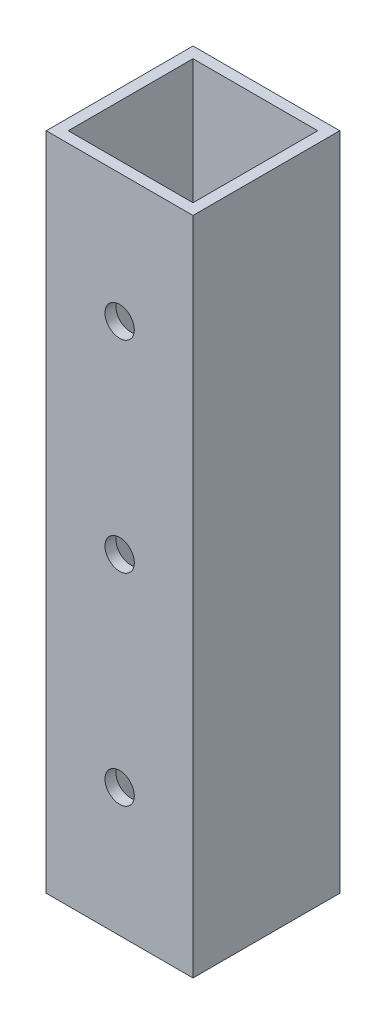
ISO-10303-21;
HEADER;
FILE_DESCRIPTION(('STEP AP214'),'2;1');
FILE_NAME('part.step','',(''),(''),'','','');
FILE_SCHEMA(('AUTOMOTIVE_DESIGN { 1 0 10303 214 1 1 1 1 }'));
ENDSEC;
DATA;
#1=APPLICATION_CONTEXT('core data for automotive mechanical design processes');
#2=APPLICATION_PROTOCOL_DEFINITION('international standard','automotive_design',2000,#1);
#3=PRODUCT_CONTEXT('',#1,'mechanical');
#4=PRODUCT('Part','Part','',(#3));
#5=PRODUCT_RELATED_PRODUCT_CATEGORY('part','',(#4));
#6=PRODUCT_DEFINITION_FORMATION('','',#4);
#7=PRODUCT_DEFINITION_CONTEXT('part definition',#1,'design');
#8=PRODUCT_DEFINITION('design','',#6,#7);
#9=PRODUCT_DEFINITION_SHAPE('','',#8);
#10=(LENGTH_UNIT() NAMED_UNIT(*) SI_UNIT(.MILLI.,.METRE.));
#11=(NAMED_UNIT(*) PLANE_ANGLE_UNIT() SI_UNIT($,.RADIAN.));
#12=(NAMED_UNIT(*) SI_UNIT($,.STERADIAN.) SOLID_ANGLE_UNIT());
#13=UNCERTAINTY_MEASURE_WITH_UNIT(LENGTH_MEASURE(1.E-05),#10,'distance_accuracy_value','');
#14=(GEOMETRIC_REPRESENTATION_CONTEXT(3) GLOBAL_UNCERTAINTY_ASSIGNED_CONTEXT((#13)) GLOBAL_UNIT_ASSIGNED_CONTEXT((#10,
#11,#12)) REPRESENTATION_CONTEXT('',''));
#15=CARTESIAN_POINT('',(0.,0.,0.));
#16=DIRECTION('',(0.,0.,1.));
#17=DIRECTION('',(1.,0.,0.));
#18=AXIS2_PLACEMENT_3D('',#15,#16,#17);
#19=CARTESIAN_POINT('',(0.,90.,0.));
#20=DIRECTION('',(0.,1.,0.));
#21=DIRECTION('',(0.,0.,1.));
#22=AXIS2_PLACEMENT_3D('',#19,#20,#21);
#23=PLANE('',#22);
#24=DIRECTION('',(0.,0.,-1.));
#25=VECTOR('',#24,1.);
#26=CARTESIAN_POINT('',(10.,90.,-10.));
#27=LINE('',#26,#25);
#28=CARTESIAN_POINT('',(10.,90.,10.));
#29=VERTEX_POINT('',#28);
#30=CARTESIAN_POINT('',(10.,90.,-10.));
#31=VERTEX_POINT('',#30);
#32=EDGE_CURVE('E144',#29,#31,#27,.T.);
#33=ORIENTED_EDGE('',*,*,#32,.T.);
#34=DIRECTION('',(-1.,0.,0.));
#35=VECTOR('',#34,1.);
#36=CARTESIAN_POINT('',(-10.,90.,-10.));
#37=LINE('',#36,#35);
#38=CARTESIAN_POINT('',(-10.,90.,-10.));
#39=VERTEX_POINT('',#38);
#40=EDGE_CURVE('E147',#31,#39,#37,.T.);
#41=ORIENTED_EDGE('',*,*,#40,.T.);
#42=DIRECTION('',(0.,0.,1.));
#43=VECTOR('',#42,1.);
#44=CARTESIAN_POINT('',(-10.,90.,-10.));
#45=LINE('',#44,#43);
#46=CARTESIAN_POINT('',(-10.,90.,10.));
#47=VERTEX_POINT('',#46);
#48=EDGE_CURVE('E150',#39,#47,#45,.T.);
#49=ORIENTED_EDGE('',*,*,#48,.T.);
#50=DIRECTION('',(1.,0.,0.));
#51=VECTOR('',#50,1.);
#52=CARTESIAN_POINT('',(-10.,90.,10.));
#53=LINE('',#52,#51);
#54=EDGE_CURVE('E152',#47,#29,#53,.T.);
#55=ORIENTED_EDGE('',*,*,#54,.T.);
#56=EDGE_LOOP('',(#33,#41,#49,#55));
#57=FACE_BOUND('',#56,.T.);
#58=DIRECTION('',(-1.,0.,0.));
#59=VECTOR('',#58,1.);
#60=CARTESIAN_POINT('',(-8.5,90.,-8.5));
#61=LINE('',#60,#59);
#62=CARTESIAN_POINT('',(8.5,90.,-8.5));
#63=VERTEX_POINT('',#62);
#64=CARTESIAN_POINT('',(-8.5,90.,-8.5));
#65=VERTEX_POINT('',#64);
#66=EDGE_CURVE('E114',#63,#65,#61,.T.);
#67=ORIENTED_EDGE('',*,*,#66,.F.);
#68=DIRECTION('',(0.,0.,-1.));
#69=VECTOR('',#68,1.);
#70=CARTESIAN_POINT('',(8.5,90.,-8.5));
#71=LINE('',#70,#69);
#72=CARTESIAN_POINT('',(8.5,90.,8.5));
#73=VERTEX_POINT('',#72);
#74=EDGE_CURVE('E106',#73,#63,#71,.T.);
#75=ORIENTED_EDGE('',*,*,#74,.F.);
#76=DIRECTION('',(1.,0.,0.));
#77=VECTOR('',#76,1.);
#78=CARTESIAN_POINT('',(-8.5,90.,8.5));
#79=LINE('',#78,#77);
#80=CARTESIAN_POINT('',(-8.5,90.,8.5));
#81=VERTEX_POINT('',#80);
#82=EDGE_CURVE('E128',#81,#73,#79,.T.);
#83=ORIENTED_EDGE('',*,*,#82,.F.);
#84=DIRECTION('',(0.,0.,1.));
#85=VECTOR('',#84,1.);
#86=CARTESIAN_POINT('',(-8.5,90.,-8.5));
#87=LINE('',#86,#85);
#88=EDGE_CURVE('E126',#65,#81,#87,.T.);
#89=ORIENTED_EDGE('',*,*,#88,.F.);
#90=EDGE_LOOP('',(#67,#75,#83,#89));
#91=FACE_BOUND('',#90,.T.);
#92=ADVANCED_FACE('F39',(#57,#91),#23,.T.);
#93=CARTESIAN_POINT('',(0.,0.,0.));
#94=DIRECTION('',(0.,1.,0.));
#95=DIRECTION('',(0.,0.,1.));
#96=AXIS2_PLACEMENT_3D('',#93,#94,#95);
#97=PLANE('',#96);
#98=DIRECTION('',(0.,0.,-1.));
#99=VECTOR('',#98,1.);
#100=CARTESIAN_POINT('',(10.,0.,-10.));
#101=LINE('',#100,#99);
#102=CARTESIAN_POINT('',(10.,0.,10.));
#103=VERTEX_POINT('',#102);
#104=CARTESIAN_POINT('',(10.,0.,-10.));
#105=VERTEX_POINT('',#104);
#106=EDGE_CURVE('E122',#103,#105,#101,.T.);
#107=ORIENTED_EDGE('',*,*,#106,.F.);
#108=DIRECTION('',(1.,0.,0.));
#109=VECTOR('',#108,1.);
#110=CARTESIAN_POINT('',(-10.,0.,10.));
#111=LINE('',#110,#109);
#112=CARTESIAN_POINT('',(-10.,0.,10.));
#113=VERTEX_POINT('',#112);
#114=EDGE_CURVE('E148',#113,#103,#111,.T.);
#115=ORIENTED_EDGE('',*,*,#114,.F.);
#116=DIRECTION('',(0.,0.,1.));
#117=VECTOR('',#116,1.);
#118=CARTESIAN_POINT('',(-10.,0.,-10.));
#119=LINE('',#118,#117);
#120=CARTESIAN_POINT('',(-10.,0.,-10.));
#121=VERTEX_POINT('',#120);
#122=EDGE_CURVE('E159',#121,#113,#119,.T.);
#123=ORIENTED_EDGE('',*,*,#122,.F.);
#124=DIRECTION('',(-1.,0.,0.));
#125=VECTOR('',#124,1.);
#126=CARTESIAN_POINT('',(-10.,0.,-10.));
#127=LINE('',#126,#125);
#128=EDGE_CURVE('E157',#105,#121,#127,.T.);
#129=ORIENTED_EDGE('',*,*,#128,.F.);
#130=EDGE_LOOP('',(#107,#115,#123,#129));
#131=FACE_BOUND('',#130,.T.);
#132=DIRECTION('',(0.,0.,-1.));
#133=VECTOR('',#132,1.);
#134=CARTESIAN_POINT('',(8.5,0.,-8.5));
#135=LINE('',#134,#133);
#136=CARTESIAN_POINT('',(8.5,0.,8.5));
#137=VERTEX_POINT('',#136);
#138=CARTESIAN_POINT('',(8.5,0.,-8.5));
#139=VERTEX_POINT('',#138);
#140=EDGE_CURVE('E64',#137,#139,#135,.T.);
#141=ORIENTED_EDGE('',*,*,#140,.T.);
#142=DIRECTION('',(-1.,0.,0.));
#143=VECTOR('',#142,1.);
#144=CARTESIAN_POINT('',(-8.5,0.,-8.5));
#145=LINE('',#144,#143);
#146=CARTESIAN_POINT('',(-8.5,0.,-8.5));
#147=VERTEX_POINT('',#146);
#148=EDGE_CURVE('E121',#139,#147,#145,.T.);
#149=ORIENTED_EDGE('',*,*,#148,.T.);
#150=DIRECTION('',(0.,0.,1.));
#151=VECTOR('',#150,1.);
#152=CARTESIAN_POINT('',(-8.5,0.,-8.5));
#153=LINE('',#152,#151);
#154=CARTESIAN_POINT('',(-8.5,0.,8.5));
#155=VERTEX_POINT('',#154);
#156=EDGE_CURVE('E136',#147,#155,#153,.T.);
#157=ORIENTED_EDGE('',*,*,#156,.T.);
#158=DIRECTION('',(1.,0.,0.));
#159=VECTOR('',#158,1.);
#160=CARTESIAN_POINT('',(-8.5,0.,8.5));
#161=LINE('',#160,#159);
#162=EDGE_CURVE('E115',#155,#137,#161,.T.);
#163=ORIENTED_EDGE('',*,*,#162,.T.);
#164=EDGE_LOOP('',(#141,#149,#157,#163));
#165=FACE_BOUND('',#164,.T.);
#166=ADVANCED_FACE('F220',(#131,#165),#97,.F.);
#167=CARTESIAN_POINT('',(10.,90.,-10.));
#168=DIRECTION('',(-1.,0.,0.));
#169=DIRECTION('',(0.,0.,1.));
#170=AXIS2_PLACEMENT_3D('',#167,#168,#169);
#171=PLANE('',#170);
#172=ORIENTED_EDGE('',*,*,#106,.T.);
#173=DIRECTION('',(0.,-1.,0.));
#174=VECTOR('',#173,1.);
#175=CARTESIAN_POINT('',(10.,90.,-10.));
#176=LINE('',#175,#174);
#177=EDGE_CURVE('E11',#31,#105,#176,.T.);
#178=ORIENTED_EDGE('',*,*,#177,.F.);
#179=ORIENTED_EDGE('',*,*,#32,.F.);
#180=DIRECTION('',(0.,-1.,0.));
#181=VECTOR('',#180,1.);
#182=CARTESIAN_POINT('',(10.,90.,10.));
#183=LINE('',#182,#181);
#184=EDGE_CURVE('E154',#29,#103,#183,.T.);
#185=ORIENTED_EDGE('',*,*,#184,.T.);
#186=EDGE_LOOP('',(#172,#178,#179,#185));
#187=FACE_BOUND('',#186,.T.);
#188=ADVANCED_FACE('F41',(#187),#171,.F.);
#189=CARTESIAN_POINT('',(-10.,90.,-10.));
#190=DIRECTION('',(0.,0.,1.));
#191=DIRECTION('',(1.,0.,0.));
#192=AXIS2_PLACEMENT_3D('',#189,#190,#191);
#193=PLANE('',#192);
#194=CARTESIAN_POINT('',(0.,72.5,-10.));
#195=DIRECTION('',(0.,0.,-1.));
#196=DIRECTION('',(-1.,0.,0.));
#197=AXIS2_PLACEMENT_3D('',#194,#195,#196);
#198=CIRCLE('',#197,2.);
#199=CARTESIAN_POINT('',(-2.,72.5,-10.));
#200=VERTEX_POINT('',#199);
#201=EDGE_CURVE('E172',#200,#200,#198,.T.);
#202=ORIENTED_EDGE('',*,*,#201,.F.);
#203=EDGE_LOOP('',(#202));
#204=FACE_BOUND('',#203,.T.);
#205=CARTESIAN_POINT('',(0.,17.5,-10.));
#206=DIRECTION('',(0.,0.,-1.));
#207=DIRECTION('',(1.,0.,0.));
#208=AXIS2_PLACEMENT_3D('',#205,#206,#207);
#209=CIRCLE('',#208,2.);
#210=CARTESIAN_POINT('',(2.,17.5,-10.));
#211=VERTEX_POINT('',#210);
#212=EDGE_CURVE('E249',#211,#211,#209,.T.);
#213=ORIENTED_EDGE('',*,*,#212,.F.);
#214=EDGE_LOOP('',(#213));
#215=FACE_BOUND('',#214,.T.);
#216=CARTESIAN_POINT('',(0.,45.,-10.));
#217=DIRECTION('',(0.,0.,-1.));
#218=DIRECTION('',(-1.,0.,0.));
#219=AXIS2_PLACEMENT_3D('',#216,#217,#218);
#220=CIRCLE('',#219,2.);
#221=CARTESIAN_POINT('',(-2.,45.,-10.));
#222=VERTEX_POINT('',#221);
#223=EDGE_CURVE('E253',#222,#222,#220,.T.);
#224=ORIENTED_EDGE('',*,*,#223,.F.);
#225=EDGE_LOOP('',(#224));
#226=FACE_BOUND('',#225,.T.);
#227=ORIENTED_EDGE('',*,*,#128,.T.);
#228=DIRECTION('',(0.,-1.,0.));
#229=VECTOR('',#228,1.);
#230=CARTESIAN_POINT('',(-10.,90.,-10.));
#231=LINE('',#230,#229);
#232=EDGE_CURVE('E48',#39,#121,#231,.T.);
#233=ORIENTED_EDGE('',*,*,#232,.F.);
#234=ORIENTED_EDGE('',*,*,#40,.F.);
#235=ORIENTED_EDGE('',*,*,#177,.T.);
#236=EDGE_LOOP('',(#227,#233,#234,#235));
#237=FACE_BOUND('',#236,.T.);
#238=ADVANCED_FACE('F235',(#204,#215,#226,#237),#193,.F.);
#239=CARTESIAN_POINT('',(-10.,90.,-10.));
#240=DIRECTION('',(1.,0.,0.));
#241=DIRECTION('',(0.,0.,-1.));
#242=AXIS2_PLACEMENT_3D('',#239,#240,#241);
#243=PLANE('',#242);
#244=ORIENTED_EDGE('',*,*,#122,.T.);
#245=DIRECTION('',(0.,-1.,0.));
#246=VECTOR('',#245,1.);
#247=CARTESIAN_POINT('',(-10.,90.,10.));
#248=LINE('',#247,#246);
#249=EDGE_CURVE('E164',#47,#113,#248,.T.);
#250=ORIENTED_EDGE('',*,*,#249,.F.);
#251=ORIENTED_EDGE('',*,*,#48,.F.);
#252=ORIENTED_EDGE('',*,*,#232,.T.);
#253=EDGE_LOOP('',(#244,#250,#251,#252));
#254=FACE_BOUND('',#253,.T.);
#255=ADVANCED_FACE('F233',(#254),#243,.F.);
#256=CARTESIAN_POINT('',(-10.,90.,10.));
#257=DIRECTION('',(0.,0.,-1.));
#258=DIRECTION('',(-1.,0.,0.));
#259=AXIS2_PLACEMENT_3D('',#256,#257,#258);
#260=PLANE('',#259);
#261=CARTESIAN_POINT('',(0.,72.5,9.99999999999999));
#262=DIRECTION('',(0.,0.,-1.));
#263=DIRECTION('',(-1.,0.,0.));
#264=AXIS2_PLACEMENT_3D('',#261,#262,#263);
#265=CIRCLE('',#264,2.);
#266=CARTESIAN_POINT('',(-2.,72.5,10.));
#267=VERTEX_POINT('',#266);
#268=EDGE_CURVE('E134',#267,#267,#265,.T.);
#269=ORIENTED_EDGE('',*,*,#268,.T.);
#270=EDGE_LOOP('',(#269));
#271=FACE_BOUND('',#270,.T.);
#272=CARTESIAN_POINT('',(0.,17.5,9.99999999999999));
#273=DIRECTION('',(0.,0.,-1.));
#274=DIRECTION('',(-1.,0.,0.));
#275=AXIS2_PLACEMENT_3D('',#272,#273,#274);
#276=CIRCLE('',#275,2.);
#277=CARTESIAN_POINT('',(-2.,17.5,10.));
#278=VERTEX_POINT('',#277);
#279=EDGE_CURVE('E180',#278,#278,#276,.T.);
#280=ORIENTED_EDGE('',*,*,#279,.T.);
#281=EDGE_LOOP('',(#280));
#282=FACE_BOUND('',#281,.T.);
#283=CARTESIAN_POINT('',(0.,45.,9.99999999999999));
#284=DIRECTION('',(0.,0.,-1.));
#285=DIRECTION('',(-1.,0.,0.));
#286=AXIS2_PLACEMENT_3D('',#283,#284,#285);
#287=CIRCLE('',#286,2.);
#288=CARTESIAN_POINT('',(-2.,45.,10.));
#289=VERTEX_POINT('',#288);
#290=EDGE_CURVE('E176',#289,#289,#287,.T.);
#291=ORIENTED_EDGE('',*,*,#290,.T.);
#292=EDGE_LOOP('',(#291));
#293=FACE_BOUND('',#292,.T.);
#294=ORIENTED_EDGE('',*,*,#114,.T.);
#295=ORIENTED_EDGE('',*,*,#184,.F.);
#296=ORIENTED_EDGE('',*,*,#54,.F.);
#297=ORIENTED_EDGE('',*,*,#249,.T.);
#298=EDGE_LOOP('',(#294,#295,#296,#297));
#299=FACE_BOUND('',#298,.T.);
#300=ADVANCED_FACE('F197',(#271,#282,#293,#299),#260,.F.);
#301=CARTESIAN_POINT('',(8.5,90.,-8.5));
#302=DIRECTION('',(-1.,0.,0.));
#303=DIRECTION('',(0.,0.,1.));
#304=AXIS2_PLACEMENT_3D('',#301,#302,#303);
#305=PLANE('',#304);
#306=ORIENTED_EDGE('',*,*,#140,.F.);
#307=DIRECTION('',(0.,-1.,0.));
#308=VECTOR('',#307,1.);
#309=CARTESIAN_POINT('',(8.5,90.,8.5));
#310=LINE('',#309,#308);
#311=EDGE_CURVE('E110',#73,#137,#310,.T.);
#312=ORIENTED_EDGE('',*,*,#311,.F.);
#313=ORIENTED_EDGE('',*,*,#74,.T.);
#314=DIRECTION('',(0.,-1.,0.));
#315=VECTOR('',#314,1.);
#316=CARTESIAN_POINT('',(8.5,90.,-8.5));
#317=LINE('',#316,#315);
#318=EDGE_CURVE('E109',#63,#139,#317,.T.);
#319=ORIENTED_EDGE('',*,*,#318,.T.);
#320=EDGE_LOOP('',(#306,#312,#313,#319));
#321=FACE_BOUND('',#320,.T.);
#322=ADVANCED_FACE('F108',(#321),#305,.T.);
#323=CARTESIAN_POINT('',(-8.5,90.,-8.5));
#324=DIRECTION('',(0.,0.,1.));
#325=DIRECTION('',(1.,0.,0.));
#326=AXIS2_PLACEMENT_3D('',#323,#324,#325);
#327=PLANE('',#326);
#328=CARTESIAN_POINT('',(0.,72.5,-8.50000000000001));
#329=DIRECTION('',(0.,0.,1.));
#330=DIRECTION('',(1.,0.,0.));
#331=AXIS2_PLACEMENT_3D('',#328,#329,#330);
#332=CIRCLE('',#331,2.);
#333=CARTESIAN_POINT('',(2.,72.5,-8.50000000000001));
#334=VERTEX_POINT('',#333);
#335=EDGE_CURVE('E192',#334,#334,#332,.T.);
#336=ORIENTED_EDGE('',*,*,#335,.F.);
#337=EDGE_LOOP('',(#336));
#338=FACE_BOUND('',#337,.T.);
#339=CARTESIAN_POINT('',(0.,17.5,-8.50000000000001));
#340=DIRECTION('',(0.,0.,1.));
#341=DIRECTION('',(1.,0.,0.));
#342=AXIS2_PLACEMENT_3D('',#339,#340,#341);
#343=CIRCLE('',#342,2.);
#344=CARTESIAN_POINT('',(2.,17.5,-8.50000000000001));
#345=VERTEX_POINT('',#344);
#346=EDGE_CURVE('E175',#345,#345,#343,.T.);
#347=ORIENTED_EDGE('',*,*,#346,.F.);
#348=EDGE_LOOP('',(#347));
#349=FACE_BOUND('',#348,.T.);
#350=CARTESIAN_POINT('',(0.,45.,-8.50000000000001));
#351=DIRECTION('',(0.,0.,1.));
#352=DIRECTION('',(1.,0.,0.));
#353=AXIS2_PLACEMENT_3D('',#350,#351,#352);
#354=CIRCLE('',#353,2.);
#355=CARTESIAN_POINT('',(2.,45.,-8.50000000000001));
#356=VERTEX_POINT('',#355);
#357=EDGE_CURVE('E171',#356,#356,#354,.T.);
#358=ORIENTED_EDGE('',*,*,#357,.F.);
#359=EDGE_LOOP('',(#358));
#360=FACE_BOUND('',#359,.T.);
#361=ORIENTED_EDGE('',*,*,#148,.F.);
#362=ORIENTED_EDGE('',*,*,#318,.F.);
#363=ORIENTED_EDGE('',*,*,#66,.T.);
#364=DIRECTION('',(0.,-1.,0.));
#365=VECTOR('',#364,1.);
#366=CARTESIAN_POINT('',(-8.5,90.,-8.5));
#367=LINE('',#366,#365);
#368=EDGE_CURVE('E123',#65,#147,#367,.T.);
#369=ORIENTED_EDGE('',*,*,#368,.T.);
#370=EDGE_LOOP('',(#361,#362,#363,#369));
#371=FACE_BOUND('',#370,.T.);
#372=ADVANCED_FACE('F118',(#338,#349,#360,#371),#327,.T.);
#373=CARTESIAN_POINT('',(-8.5,90.,-8.5));
#374=DIRECTION('',(1.,0.,0.));
#375=DIRECTION('',(0.,0.,-1.));
#376=AXIS2_PLACEMENT_3D('',#373,#374,#375);
#377=PLANE('',#376);
#378=ORIENTED_EDGE('',*,*,#156,.F.);
#379=ORIENTED_EDGE('',*,*,#368,.F.);
#380=ORIENTED_EDGE('',*,*,#88,.T.);
#381=DIRECTION('',(0.,-1.,0.));
#382=VECTOR('',#381,1.);
#383=CARTESIAN_POINT('',(-8.5,90.,8.5));
#384=LINE('',#383,#382);
#385=EDGE_CURVE('E56',#81,#155,#384,.T.);
#386=ORIENTED_EDGE('',*,*,#385,.T.);
#387=EDGE_LOOP('',(#378,#379,#380,#386));
#388=FACE_BOUND('',#387,.T.);
#389=ADVANCED_FACE('F269',(#388),#377,.T.);
#390=CARTESIAN_POINT('',(-8.5,90.,8.5));
#391=DIRECTION('',(0.,0.,-1.));
#392=DIRECTION('',(-1.,0.,0.));
#393=AXIS2_PLACEMENT_3D('',#390,#391,#392);
#394=PLANE('',#393);
#395=CARTESIAN_POINT('',(0.,72.5,8.50000000000001));
#396=DIRECTION('',(0.,0.,-1.));
#397=DIRECTION('',(-1.,0.,0.));
#398=AXIS2_PLACEMENT_3D('',#395,#396,#397);
#399=CIRCLE('',#398,2.);
#400=CARTESIAN_POINT('',(-2.,72.5,8.50000000000001));
#401=VERTEX_POINT('',#400);
#402=EDGE_CURVE('E43',#401,#401,#399,.T.);
#403=ORIENTED_EDGE('',*,*,#402,.F.);
#404=EDGE_LOOP('',(#403));
#405=FACE_BOUND('',#404,.T.);
#406=CARTESIAN_POINT('',(0.,17.5,8.50000000000001));
#407=DIRECTION('',(0.,0.,-1.));
#408=DIRECTION('',(-1.,0.,0.));
#409=AXIS2_PLACEMENT_3D('',#406,#407,#408);
#410=CIRCLE('',#409,2.);
#411=CARTESIAN_POINT('',(-2.,17.5,8.50000000000001));
#412=VERTEX_POINT('',#411);
#413=EDGE_CURVE('E173',#412,#412,#410,.T.);
#414=ORIENTED_EDGE('',*,*,#413,.F.);
#415=EDGE_LOOP('',(#414));
#416=FACE_BOUND('',#415,.T.);
#417=CARTESIAN_POINT('',(0.,45.,8.50000000000001));
#418=DIRECTION('',(0.,0.,-1.));
#419=DIRECTION('',(-1.,0.,0.));
#420=AXIS2_PLACEMENT_3D('',#417,#418,#419);
#421=CIRCLE('',#420,2.);
#422=CARTESIAN_POINT('',(-2.,45.,8.50000000000001));
#423=VERTEX_POINT('',#422);
#424=EDGE_CURVE('E169',#423,#423,#421,.T.);
#425=ORIENTED_EDGE('',*,*,#424,.F.);
#426=EDGE_LOOP('',(#425));
#427=FACE_BOUND('',#426,.T.);
#428=ORIENTED_EDGE('',*,*,#162,.F.);
#429=ORIENTED_EDGE('',*,*,#385,.F.);
#430=ORIENTED_EDGE('',*,*,#82,.T.);
#431=ORIENTED_EDGE('',*,*,#311,.T.);
#432=EDGE_LOOP('',(#428,#429,#430,#431));
#433=FACE_BOUND('',#432,.T.);
#434=ADVANCED_FACE('F267',(#405,#416,#427,#433),#394,.T.);
#435=CARTESIAN_POINT('',(0.,45.,90.));
#436=DIRECTION('',(0.,0.,-1.));
#437=DIRECTION('',(-1.,0.,0.));
#438=AXIS2_PLACEMENT_3D('',#435,#436,#437);
#439=CYLINDRICAL_SURFACE('',#438,2.);
#440=CARTESIAN_POINT('',(-2.,45.,8.50000000000001));
#441=CARTESIAN_POINT('',(-2.,45.,8.51562500000001));
#442=CARTESIAN_POINT('',(-2.,45.,8.53125000000001));
#443=CARTESIAN_POINT('',(-2.,45.,8.56250000000001));
#444=CARTESIAN_POINT('',(-2.,45.,8.57812500000001));
#445=CARTESIAN_POINT('',(-2.,45.,8.60937500000001));
#446=CARTESIAN_POINT('',(-2.,45.,8.62500000000001));
#447=CARTESIAN_POINT('',(-2.,45.,8.65625000000001));
#448=CARTESIAN_POINT('',(-2.,45.,8.67187500000001));
#449=CARTESIAN_POINT('',(-2.,45.,8.70312500000001));
#450=CARTESIAN_POINT('',(-2.,45.,8.71875000000001));
#451=CARTESIAN_POINT('',(-2.,45.,8.75));
#452=CARTESIAN_POINT('',(-2.,45.,8.765625));
#453=CARTESIAN_POINT('',(-2.,45.,8.796875));
#454=CARTESIAN_POINT('',(-2.,45.,8.81250000000001));
#455=CARTESIAN_POINT('',(-2.,45.,8.84375000000001));
#456=CARTESIAN_POINT('',(-2.,45.,8.85937500000001));
#457=CARTESIAN_POINT('',(-2.,45.,8.89062500000001));
#458=CARTESIAN_POINT('',(-2.,45.,8.90625000000001));
#459=CARTESIAN_POINT('',(-2.,45.,8.93750000000001));
#460=CARTESIAN_POINT('',(-2.,45.,8.95312500000001));
#461=CARTESIAN_POINT('',(-2.,45.,8.98437500000001));
#462=CARTESIAN_POINT('',(-2.,45.,9.00000000000001));
#463=CARTESIAN_POINT('',(-2.,45.,9.03125000000001));
#464=CARTESIAN_POINT('',(-2.,45.,9.04687500000001));
#465=CARTESIAN_POINT('',(-2.,45.,9.078125));
#466=CARTESIAN_POINT('',(-2.,45.,9.09375));
#467=CARTESIAN_POINT('',(-2.,45.,9.125));
#468=CARTESIAN_POINT('',(-2.,45.,9.14062500000001));
#469=CARTESIAN_POINT('',(-2.,45.,9.17187500000001));
#470=CARTESIAN_POINT('',(-2.,45.,9.18750000000001));
#471=CARTESIAN_POINT('',(-2.,45.,9.21875000000001));
#472=CARTESIAN_POINT('',(-2.,45.,9.23437500000001));
#473=CARTESIAN_POINT('',(-2.,45.,9.26562500000001));
#474=CARTESIAN_POINT('',(-2.,45.,9.28125000000001));
#475=CARTESIAN_POINT('',(-2.,45.,9.31250000000001));
#476=CARTESIAN_POINT('',(-2.,45.,9.32812500000001));
#477=CARTESIAN_POINT('',(-2.,45.,9.35937500000001));
#478=CARTESIAN_POINT('',(-2.,45.,9.37500000000001));
#479=CARTESIAN_POINT('',(-2.,45.,9.40625000000001));
#480=CARTESIAN_POINT('',(-2.,45.,9.42187500000002));
#481=CARTESIAN_POINT('',(-2.,45.,9.45312500000001));
#482=CARTESIAN_POINT('',(-2.,45.,9.46875000000001));
#483=CARTESIAN_POINT('',(-2.,45.,9.5));
#484=CARTESIAN_POINT('',(-2.,45.,9.51562500000001));
#485=CARTESIAN_POINT('',(-2.,45.,9.54687500000001));
#486=CARTESIAN_POINT('',(-2.,45.,9.56250000000001));
#487=CARTESIAN_POINT('',(-2.,45.,9.59375000000001));
#488=CARTESIAN_POINT('',(-2.,45.,9.60937500000001));
#489=CARTESIAN_POINT('',(-2.,45.,9.64062500000001));
#490=CARTESIAN_POINT('',(-2.,45.,9.65625000000001));
#491=CARTESIAN_POINT('',(-2.,45.,9.68750000000001));
#492=CARTESIAN_POINT('',(-2.,45.,9.70312500000001));
#493=CARTESIAN_POINT('',(-2.,45.,9.73437500000001));
#494=CARTESIAN_POINT('',(-2.,45.,9.75000000000001));
#495=CARTESIAN_POINT('',(-2.,45.,9.78125000000001));
#496=CARTESIAN_POINT('',(-2.,45.,9.79687500000001));
#497=CARTESIAN_POINT('',(-2.,45.,9.828125));
#498=CARTESIAN_POINT('',(-2.,45.,9.84375));
#499=CARTESIAN_POINT('',(-2.,45.,9.875));
#500=CARTESIAN_POINT('',(-2.,45.,9.89062500000001));
#501=CARTESIAN_POINT('',(-2.,45.,9.92187500000001));
#502=CARTESIAN_POINT('',(-2.,45.,9.93750000000001));
#503=CARTESIAN_POINT('',(-2.,45.,9.96875000000001));
#504=CARTESIAN_POINT('',(-2.,45.,9.98437500000001));
#505=CARTESIAN_POINT('',(-2.,45.,10.));
#506=B_SPLINE_CURVE_WITH_KNOTS('',3,(#440,#441,#442,#443,#444,#445,#446,#447,#448,#449,#450,
#451,#452,#453,#454,#455,#456,#457,#458,#459,#460,#461,#462,#463,#464,#465,#466,#467,#468,#469,
#470,#471,#472,#473,#474,#475,#476,#477,#478,#479,#480,#481,#482,#483,#484,#485,#486,#487,#488,
#489,#490,#491,#492,#493,#494,#495,#496,#497,#498,#499,#500,#501,#502,#503,#504,#505),
.UNSPECIFIED.,.F.,.F.,(4,2,2,2,2,2,2,2,2,2,2,2,2,2,2,2,2,2,2,2,2,2,2,2,2,2,2,2,2,2,2,2,4),(0.,
0.0468750000000018,0.0937500000000036,0.140625000000005,0.187500000000007,0.234374999999995,
0.281249999999997,0.328124999999999,0.375,0.421875000000002,0.468750000000004,0.515625000000006,
0.562499999999994,0.609374999999995,0.656249999999997,0.703124999999999,0.750000000000001,
0.796875000000002,0.843750000000004,0.890625000000006,0.937500000000008,0.984374999999996,
1.03125,1.078125,1.125,1.171875,1.21875,1.26562500000001,1.31249999999999,1.359375,1.40625,
1.453125,1.5),.UNSPECIFIED.);
#507=EDGE_CURVE('BSEAM214',#423,#289,#506,.T.);
#508=ORIENTED_EDGE('',*,*,#424,.T.);
#509=ORIENTED_EDGE('',*,*,#290,.F.);
#510=ORIENTED_EDGE('',*,*,#507,.T.);
#511=ORIENTED_EDGE('',*,*,#507,.F.);
#512=EDGE_LOOP('',(#508,#510,#509,#511));
#513=FACE_BOUND('',#512,.T.);
#514=ADVANCED_FACE('F214',(#513),#439,.F.);
#515=CARTESIAN_POINT('',(0.,17.5,90.));
#516=DIRECTION('',(0.,0.,-1.));
#517=DIRECTION('',(-1.,0.,0.));
#518=AXIS2_PLACEMENT_3D('',#515,#516,#517);
#519=CYLINDRICAL_SURFACE('',#518,2.);
#520=CARTESIAN_POINT('',(-2.,17.5,8.50000000000001));
#521=CARTESIAN_POINT('',(-2.,17.5,8.51562500000001));
#522=CARTESIAN_POINT('',(-2.,17.5,8.53125000000001));
#523=CARTESIAN_POINT('',(-2.,17.5,8.56250000000001));
#524=CARTESIAN_POINT('',(-2.,17.5,8.57812500000001));
#525=CARTESIAN_POINT('',(-2.,17.5,8.60937500000001));
#526=CARTESIAN_POINT('',(-2.,17.5,8.62500000000001));
#527=CARTESIAN_POINT('',(-2.,17.5,8.65625000000001));
#528=CARTESIAN_POINT('',(-2.,17.5,8.67187500000001));
#529=CARTESIAN_POINT('',(-2.,17.5,8.70312500000001));
#530=CARTESIAN_POINT('',(-2.,17.5,8.71875000000001));
#531=CARTESIAN_POINT('',(-2.,17.5,8.75));
#532=CARTESIAN_POINT('',(-2.,17.5,8.765625));
#533=CARTESIAN_POINT('',(-2.,17.5,8.796875));
#534=CARTESIAN_POINT('',(-2.,17.5,8.81250000000001));
#535=CARTESIAN_POINT('',(-2.,17.5,8.84375000000001));
#536=CARTESIAN_POINT('',(-2.,17.5,8.85937500000001));
#537=CARTESIAN_POINT('',(-2.,17.5,8.89062500000001));
#538=CARTESIAN_POINT('',(-2.,17.5,8.90625000000001));
#539=CARTESIAN_POINT('',(-2.,17.5,8.93750000000001));
#540=CARTESIAN_POINT('',(-2.,17.5,8.95312500000001));
#541=CARTESIAN_POINT('',(-2.,17.5,8.98437500000001));
#542=CARTESIAN_POINT('',(-2.,17.5,9.00000000000001));
#543=CARTESIAN_POINT('',(-2.,17.5,9.03125000000001));
#544=CARTESIAN_POINT('',(-2.,17.5,9.04687500000001));
#545=CARTESIAN_POINT('',(-2.,17.5,9.078125));
#546=CARTESIAN_POINT('',(-2.,17.5,9.09375));
#547=CARTESIAN_POINT('',(-2.,17.5,9.125));
#548=CARTESIAN_POINT('',(-2.,17.5,9.14062500000001));
#549=CARTESIAN_POINT('',(-2.,17.5,9.17187500000001));
#550=CARTESIAN_POINT('',(-2.,17.5,9.18750000000001));
#551=CARTESIAN_POINT('',(-2.,17.5,9.21875000000001));
#552=CARTESIAN_POINT('',(-2.,17.5,9.23437500000001));
#553=CARTESIAN_POINT('',(-2.,17.5,9.26562500000001));
#554=CARTESIAN_POINT('',(-2.,17.5,9.28125000000001));
#555=CARTESIAN_POINT('',(-2.,17.5,9.31250000000001));
#556=CARTESIAN_POINT('',(-2.,17.5,9.32812500000001));
#557=CARTESIAN_POINT('',(-2.,17.5,9.35937500000001));
#558=CARTESIAN_POINT('',(-2.,17.5,9.37500000000001));
#559=CARTESIAN_POINT('',(-2.,17.5,9.40625000000001));
#560=CARTESIAN_POINT('',(-2.,17.5,9.42187500000002));
#561=CARTESIAN_POINT('',(-2.,17.5,9.45312500000001));
#562=CARTESIAN_POINT('',(-2.,17.5,9.46875000000001));
#563=CARTESIAN_POINT('',(-2.,17.5,9.5));
#564=CARTESIAN_POINT('',(-2.,17.5,9.51562500000001));
#565=CARTESIAN_POINT('',(-2.,17.5,9.54687500000001));
#566=CARTESIAN_POINT('',(-2.,17.5,9.56250000000001));
#567=CARTESIAN_POINT('',(-2.,17.5,9.59375000000001));
#568=CARTESIAN_POINT('',(-2.,17.5,9.60937500000001));
#569=CARTESIAN_POINT('',(-2.,17.5,9.64062500000001));
#570=CARTESIAN_POINT('',(-2.,17.5,9.65625000000001));
#571=CARTESIAN_POINT('',(-2.,17.5,9.68750000000001));
#572=CARTESIAN_POINT('',(-2.,17.5,9.70312500000001));
#573=CARTESIAN_POINT('',(-2.,17.5,9.73437500000001));
#574=CARTESIAN_POINT('',(-2.,17.5,9.75000000000001));
#575=CARTESIAN_POINT('',(-2.,17.5,9.78125000000001));
#576=CARTESIAN_POINT('',(-2.,17.5,9.79687500000001));
#577=CARTESIAN_POINT('',(-2.,17.5,9.828125));
#578=CARTESIAN_POINT('',(-2.,17.5,9.84375));
#579=CARTESIAN_POINT('',(-2.,17.5,9.875));
#580=CARTESIAN_POINT('',(-2.,17.5,9.89062500000001));
#581=CARTESIAN_POINT('',(-2.,17.5,9.92187500000001));
#582=CARTESIAN_POINT('',(-2.,17.5,9.93750000000001));
#583=CARTESIAN_POINT('',(-2.,17.5,9.96875000000001));
#584=CARTESIAN_POINT('',(-2.,17.5,9.98437500000001));
#585=CARTESIAN_POINT('',(-2.,17.5,10.));
#586=B_SPLINE_CURVE_WITH_KNOTS('',3,(#520,#521,#522,#523,#524,#525,#526,#527,#528,#529,#530,
#531,#532,#533,#534,#535,#536,#537,#538,#539,#540,#541,#542,#543,#544,#545,#546,#547,#548,#549,
#550,#551,#552,#553,#554,#555,#556,#557,#558,#559,#560,#561,#562,#563,#564,#565,#566,#567,#568,
#569,#570,#571,#572,#573,#574,#575,#576,#577,#578,#579,#580,#581,#582,#583,#584,#585),
.UNSPECIFIED.,.F.,.F.,(4,2,2,2,2,2,2,2,2,2,2,2,2,2,2,2,2,2,2,2,2,2,2,2,2,2,2,2,2,2,2,2,4),(0.,
0.0468750000000018,0.0937500000000036,0.140625000000005,0.187500000000007,0.234374999999995,
0.281249999999997,0.328124999999999,0.375,0.421875000000002,0.468750000000004,0.515625000000006,
0.562499999999994,0.609374999999995,0.656249999999997,0.703124999999999,0.750000000000001,
0.796875000000002,0.843750000000004,0.890625000000006,0.937500000000008,0.984374999999996,
1.03125,1.078125,1.125,1.171875,1.21875,1.26562500000001,1.31249999999999,1.359375,1.40625,
1.453125,1.5),.UNSPECIFIED.);
#587=EDGE_CURVE('BSEAM203',#412,#278,#586,.T.);
#588=ORIENTED_EDGE('',*,*,#413,.T.);
#589=ORIENTED_EDGE('',*,*,#279,.F.);
#590=ORIENTED_EDGE('',*,*,#587,.T.);
#591=ORIENTED_EDGE('',*,*,#587,.F.);
#592=EDGE_LOOP('',(#588,#590,#589,#591));
#593=FACE_BOUND('',#592,.T.);
#594=ADVANCED_FACE('F203',(#593),#519,.F.);
#595=CARTESIAN_POINT('',(0.,72.5,90.));
#596=DIRECTION('',(0.,0.,-1.));
#597=DIRECTION('',(-1.,0.,0.));
#598=AXIS2_PLACEMENT_3D('',#595,#596,#597);
#599=CYLINDRICAL_SURFACE('',#598,2.);
#600=CARTESIAN_POINT('',(-2.,72.5,8.50000000000001));
#601=CARTESIAN_POINT('',(-2.,72.5,8.51562500000001));
#602=CARTESIAN_POINT('',(-2.,72.5,8.53125000000001));
#603=CARTESIAN_POINT('',(-2.,72.5,8.56250000000001));
#604=CARTESIAN_POINT('',(-2.,72.5,8.57812500000001));
#605=CARTESIAN_POINT('',(-2.,72.5,8.60937500000001));
#606=CARTESIAN_POINT('',(-2.,72.5,8.62500000000001));
#607=CARTESIAN_POINT('',(-2.,72.5,8.65625000000001));
#608=CARTESIAN_POINT('',(-2.,72.5,8.67187500000001));
#609=CARTESIAN_POINT('',(-2.,72.5,8.70312500000001));
#610=CARTESIAN_POINT('',(-2.,72.5,8.71875000000001));
#611=CARTESIAN_POINT('',(-2.,72.5,8.75));
#612=CARTESIAN_POINT('',(-2.,72.5,8.765625));
#613=CARTESIAN_POINT('',(-2.,72.5,8.796875));
#614=CARTESIAN_POINT('',(-2.,72.5,8.81250000000001));
#615=CARTESIAN_POINT('',(-2.,72.5,8.84375000000001));
#616=CARTESIAN_POINT('',(-2.,72.5,8.85937500000001));
#617=CARTESIAN_POINT('',(-2.,72.5,8.89062500000001));
#618=CARTESIAN_POINT('',(-2.,72.5,8.90625000000001));
#619=CARTESIAN_POINT('',(-2.,72.5,8.93750000000001));
#620=CARTESIAN_POINT('',(-2.,72.5,8.95312500000001));
#621=CARTESIAN_POINT('',(-2.,72.5,8.98437500000001));
#622=CARTESIAN_POINT('',(-2.,72.5,9.00000000000001));
#623=CARTESIAN_POINT('',(-2.,72.5,9.03125000000001));
#624=CARTESIAN_POINT('',(-2.,72.5,9.04687500000001));
#625=CARTESIAN_POINT('',(-2.,72.5,9.078125));
#626=CARTESIAN_POINT('',(-2.,72.5,9.09375));
#627=CARTESIAN_POINT('',(-2.,72.5,9.125));
#628=CARTESIAN_POINT('',(-2.,72.5,9.14062500000001));
#629=CARTESIAN_POINT('',(-2.,72.5,9.17187500000001));
#630=CARTESIAN_POINT('',(-2.,72.5,9.18750000000001));
#631=CARTESIAN_POINT('',(-2.,72.5,9.21875000000001));
#632=CARTESIAN_POINT('',(-2.,72.5,9.23437500000001));
#633=CARTESIAN_POINT('',(-2.,72.5,9.26562500000001));
#634=CARTESIAN_POINT('',(-2.,72.5,9.28125000000001));
#635=CARTESIAN_POINT('',(-2.,72.5,9.31250000000001));
#636=CARTESIAN_POINT('',(-2.,72.5,9.32812500000001));
#637=CARTESIAN_POINT('',(-2.,72.5,9.35937500000001));
#638=CARTESIAN_POINT('',(-2.,72.5,9.37500000000001));
#639=CARTESIAN_POINT('',(-2.,72.5,9.40625000000001));
#640=CARTESIAN_POINT('',(-2.,72.5,9.42187500000002));
#641=CARTESIAN_POINT('',(-2.,72.5,9.45312500000001));
#642=CARTESIAN_POINT('',(-2.,72.5,9.46875000000001));
#643=CARTESIAN_POINT('',(-2.,72.5,9.5));
#644=CARTESIAN_POINT('',(-2.,72.5,9.51562500000001));
#645=CARTESIAN_POINT('',(-2.,72.5,9.54687500000001));
#646=CARTESIAN_POINT('',(-2.,72.5,9.56250000000001));
#647=CARTESIAN_POINT('',(-2.,72.5,9.59375000000001));
#648=CARTESIAN_POINT('',(-2.,72.5,9.60937500000001));
#649=CARTESIAN_POINT('',(-2.,72.5,9.64062500000001));
#650=CARTESIAN_POINT('',(-2.,72.5,9.65625000000001));
#651=CARTESIAN_POINT('',(-2.,72.5,9.68750000000001));
#652=CARTESIAN_POINT('',(-2.,72.5,9.70312500000001));
#653=CARTESIAN_POINT('',(-2.,72.5,9.73437500000001));
#654=CARTESIAN_POINT('',(-2.,72.5,9.75000000000001));
#655=CARTESIAN_POINT('',(-2.,72.5,9.78125000000001));
#656=CARTESIAN_POINT('',(-2.,72.5,9.79687500000001));
#657=CARTESIAN_POINT('',(-2.,72.5,9.828125));
#658=CARTESIAN_POINT('',(-2.,72.5,9.84375));
#659=CARTESIAN_POINT('',(-2.,72.5,9.875));
#660=CARTESIAN_POINT('',(-2.,72.5,9.89062500000001));
#661=CARTESIAN_POINT('',(-2.,72.5,9.92187500000001));
#662=CARTESIAN_POINT('',(-2.,72.5,9.93750000000001));
#663=CARTESIAN_POINT('',(-2.,72.5,9.96875000000001));
#664=CARTESIAN_POINT('',(-2.,72.5,9.98437500000001));
#665=CARTESIAN_POINT('',(-2.,72.5,10.));
#666=B_SPLINE_CURVE_WITH_KNOTS('',3,(#600,#601,#602,#603,#604,#605,#606,#607,#608,#609,#610,
#611,#612,#613,#614,#615,#616,#617,#618,#619,#620,#621,#622,#623,#624,#625,#626,#627,#628,#629,
#630,#631,#632,#633,#634,#635,#636,#637,#638,#639,#640,#641,#642,#643,#644,#645,#646,#647,#648,
#649,#650,#651,#652,#653,#654,#655,#656,#657,#658,#659,#660,#661,#662,#663,#664,#665),
.UNSPECIFIED.,.F.,.F.,(4,2,2,2,2,2,2,2,2,2,2,2,2,2,2,2,2,2,2,2,2,2,2,2,2,2,2,2,2,2,2,2,4),(0.,
0.0468750000000018,0.0937500000000036,0.140625000000005,0.187500000000007,0.234374999999995,
0.281249999999997,0.328124999999999,0.375,0.421875000000002,0.468750000000004,0.515625000000006,
0.562499999999994,0.609374999999995,0.656249999999997,0.703124999999999,0.750000000000001,
0.796875000000002,0.843750000000004,0.890625000000006,0.937500000000008,0.984374999999996,
1.03125,1.078125,1.125,1.171875,1.21875,1.26562500000001,1.31249999999999,1.359375,1.40625,
1.453125,1.5),.UNSPECIFIED.);
#667=EDGE_CURVE('BSEAM200',#401,#267,#666,.T.);
#668=ORIENTED_EDGE('',*,*,#402,.T.);
#669=ORIENTED_EDGE('',*,*,#268,.F.);
#670=ORIENTED_EDGE('',*,*,#667,.T.);
#671=ORIENTED_EDGE('',*,*,#667,.F.);
#672=EDGE_LOOP('',(#668,#670,#669,#671));
#673=FACE_BOUND('',#672,.T.);
#674=ADVANCED_FACE('F200',(#673),#599,.F.);
#675=ORIENTED_EDGE('',*,*,#357,.T.);
#676=EDGE_LOOP('',(#675));
#677=FACE_BOUND('',#676,.T.);
#678=ORIENTED_EDGE('',*,*,#223,.T.);
#679=EDGE_LOOP('',(#678));
#680=FACE_BOUND('',#679,.T.);
#681=ADVANCED_FACE('F202',(#677,#680),#439,.F.);
#682=ORIENTED_EDGE('',*,*,#346,.T.);
#683=EDGE_LOOP('',(#682));
#684=FACE_BOUND('',#683,.T.);
#685=ORIENTED_EDGE('',*,*,#212,.T.);
#686=EDGE_LOOP('',(#685));
#687=FACE_BOUND('',#686,.T.);
#688=ADVANCED_FACE('F211',(#684,#687),#519,.F.);
#689=ORIENTED_EDGE('',*,*,#335,.T.);
#690=EDGE_LOOP('',(#689));
#691=FACE_BOUND('',#690,.T.);
#692=ORIENTED_EDGE('',*,*,#201,.T.);
#693=EDGE_LOOP('',(#692));
#694=FACE_BOUND('',#693,.T.);
#695=ADVANCED_FACE('F206',(#691,#694),#599,.F.);
#696=CLOSED_SHELL('',(#92,#166,#188,#238,#255,#300,#322,#372,#389,#434,#514,#594,#674,#681,#688,#695));
#697=MANIFOLD_SOLID_BREP('B2',#696);
#698=ADVANCED_BREP_SHAPE_REPRESENTATION('',(#18,#697),#14);
#699=SHAPE_DEFINITION_REPRESENTATION(#9,#698);
ENDSEC;
END-ISO-10303-21;
